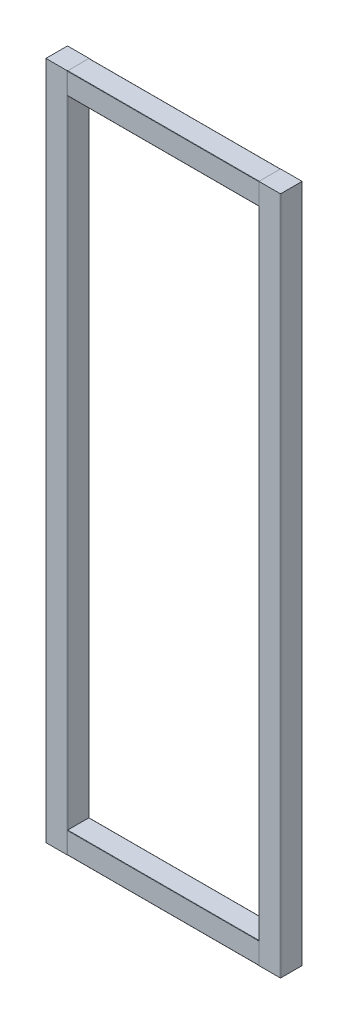
ISO-10303-21;
HEADER;
FILE_DESCRIPTION(('STEP AP214'),'2;1');
FILE_NAME('part.step','',(''),(''),'','','');
FILE_SCHEMA(('AUTOMOTIVE_DESIGN { 1 0 10303 214 1 1 1 1 }'));
ENDSEC;
DATA;
#1=APPLICATION_CONTEXT('core data for automotive mechanical design processes');
#2=APPLICATION_PROTOCOL_DEFINITION('international standard','automotive_design',2000,#1);
#3=PRODUCT_CONTEXT('',#1,'mechanical');
#4=PRODUCT('Part','Part','',(#3));
#5=PRODUCT_RELATED_PRODUCT_CATEGORY('part','',(#4));
#6=PRODUCT_DEFINITION_FORMATION('','',#4);
#7=PRODUCT_DEFINITION_CONTEXT('part definition',#1,'design');
#8=PRODUCT_DEFINITION('design','',#6,#7);
#9=PRODUCT_DEFINITION_SHAPE('','',#8);
#10=(LENGTH_UNIT() NAMED_UNIT(*) SI_UNIT(.MILLI.,.METRE.));
#11=(NAMED_UNIT(*) PLANE_ANGLE_UNIT() SI_UNIT($,.RADIAN.));
#12=(NAMED_UNIT(*) SI_UNIT($,.STERADIAN.) SOLID_ANGLE_UNIT());
#13=UNCERTAINTY_MEASURE_WITH_UNIT(LENGTH_MEASURE(1.E-05),#10,'distance_accuracy_value','');
#14=(GEOMETRIC_REPRESENTATION_CONTEXT(3) GLOBAL_UNCERTAINTY_ASSIGNED_CONTEXT((#13)) GLOBAL_UNIT_ASSIGNED_CONTEXT((#10,
#11,#12)) REPRESENTATION_CONTEXT('',''));
#15=CARTESIAN_POINT('',(0.,0.,0.));
#16=DIRECTION('',(0.,0.,1.));
#17=DIRECTION('',(1.,0.,0.));
#18=AXIS2_PLACEMENT_3D('',#15,#16,#17);
#19=CARTESIAN_POINT('',(155.5,532.5,-17.));
#20=DIRECTION('',(0.,-1.,0.));
#21=DIRECTION('',(0.,0.,-1.));
#22=AXIS2_PLACEMENT_3D('',#19,#20,#21);
#23=CYLINDRICAL_SURFACE('',#22,0.5);
#24=CARTESIAN_POINT('',(155.5,-550.,-17.));
#25=DIRECTION('',(0.,-1.,0.));
#26=DIRECTION('',(0.,0.,-1.));
#27=AXIS2_PLACEMENT_3D('',#24,#25,#26);
#28=CIRCLE('',#27,0.5);
#29=CARTESIAN_POINT('',(155.,-550.,-17.));
#30=VERTEX_POINT('',#29);
#31=CARTESIAN_POINT('',(155.5,-550.,-17.5));
#32=VERTEX_POINT('',#31);
#33=EDGE_CURVE('E161',#30,#32,#28,.T.);
#34=ORIENTED_EDGE('',*,*,#33,.F.);
#35=DIRECTION('',(0.,-1.,0.));
#36=VECTOR('',#35,1.);
#37=CARTESIAN_POINT('',(155.,532.5,-17.));
#38=LINE('',#37,#36);
#39=CARTESIAN_POINT('',(155.,550.,-17.));
#40=VERTEX_POINT('',#39);
#41=EDGE_CURVE('E203',#40,#30,#38,.T.);
#42=ORIENTED_EDGE('',*,*,#41,.F.);
#43=CARTESIAN_POINT('',(155.5,550.,-17.));
#44=DIRECTION('',(0.,1.,0.));
#45=DIRECTION('',(0.,0.,1.));
#46=AXIS2_PLACEMENT_3D('',#43,#44,#45);
#47=CIRCLE('',#46,0.5);
#48=CARTESIAN_POINT('',(155.5,550.,-17.5));
#49=VERTEX_POINT('',#48);
#50=EDGE_CURVE('E148',#49,#40,#47,.T.);
#51=ORIENTED_EDGE('',*,*,#50,.F.);
#52=DIRECTION('',(0.,-1.,0.));
#53=VECTOR('',#52,1.);
#54=CARTESIAN_POINT('',(155.5,532.5,-17.5));
#55=LINE('',#54,#53);
#56=EDGE_CURVE('E84',#49,#32,#55,.T.);
#57=ORIENTED_EDGE('',*,*,#56,.T.);
#58=EDGE_LOOP('',(#34,#42,#51,#57));
#59=FACE_BOUND('',#58,.T.);
#60=ADVANCED_FACE('F80',(#59),#23,.T.);
#61=CARTESIAN_POINT('',(155.,532.5,-17.));
#62=DIRECTION('',(1.,0.,0.));
#63=DIRECTION('',(0.,0.,-1.));
#64=AXIS2_PLACEMENT_3D('',#61,#62,#63);
#65=PLANE('',#64);
#66=DIRECTION('',(0.,0.,-1.));
#67=VECTOR('',#66,1.);
#68=CARTESIAN_POINT('',(155.,-550.,-17.));
#69=LINE('',#68,#67);
#70=CARTESIAN_POINT('',(155.,-550.,17.));
#71=VERTEX_POINT('',#70);
#72=EDGE_CURVE('E155',#71,#30,#69,.T.);
#73=ORIENTED_EDGE('',*,*,#72,.F.);
#74=DIRECTION('',(0.,-1.,0.));
#75=VECTOR('',#74,1.);
#76=CARTESIAN_POINT('',(155.,532.5,17.));
#77=LINE('',#76,#75);
#78=CARTESIAN_POINT('',(155.,550.,17.));
#79=VERTEX_POINT('',#78);
#80=EDGE_CURVE('E200',#79,#71,#77,.T.);
#81=ORIENTED_EDGE('',*,*,#80,.F.);
#82=DIRECTION('',(0.,0.,1.));
#83=VECTOR('',#82,1.);
#84=CARTESIAN_POINT('',(155.,550.,-17.));
#85=LINE('',#84,#83);
#86=EDGE_CURVE('E232',#40,#79,#85,.T.);
#87=ORIENTED_EDGE('',*,*,#86,.F.);
#88=ORIENTED_EDGE('',*,*,#41,.T.);
#89=EDGE_LOOP('',(#73,#81,#87,#88));
#90=FACE_BOUND('',#89,.T.);
#91=ADVANCED_FACE('F221',(#90),#65,.F.);
#92=CARTESIAN_POINT('',(155.5,532.5,17.));
#93=DIRECTION('',(0.,-1.,0.));
#94=DIRECTION('',(0.,0.,-1.));
#95=AXIS2_PLACEMENT_3D('',#92,#93,#94);
#96=CYLINDRICAL_SURFACE('',#95,0.5);
#97=CARTESIAN_POINT('',(155.5,-550.,17.));
#98=DIRECTION('',(0.,-1.,0.));
#99=DIRECTION('',(0.,0.,-1.));
#100=AXIS2_PLACEMENT_3D('',#97,#98,#99);
#101=CIRCLE('',#100,0.5);
#102=CARTESIAN_POINT('',(155.5,-550.,17.5));
#103=VERTEX_POINT('',#102);
#104=EDGE_CURVE('E13',#103,#71,#101,.T.);
#105=ORIENTED_EDGE('',*,*,#104,.F.);
#106=DIRECTION('',(0.,-1.,0.));
#107=VECTOR('',#106,1.);
#108=CARTESIAN_POINT('',(155.5,532.5,17.5));
#109=LINE('',#108,#107);
#110=CARTESIAN_POINT('',(155.5,550.,17.5));
#111=VERTEX_POINT('',#110);
#112=EDGE_CURVE('E196',#111,#103,#109,.T.);
#113=ORIENTED_EDGE('',*,*,#112,.F.);
#114=CARTESIAN_POINT('',(155.5,550.,17.));
#115=DIRECTION('',(0.,1.,0.));
#116=DIRECTION('',(0.,0.,1.));
#117=AXIS2_PLACEMENT_3D('',#114,#115,#116);
#118=CIRCLE('',#117,0.5);
#119=EDGE_CURVE('E228',#79,#111,#118,.T.);
#120=ORIENTED_EDGE('',*,*,#119,.F.);
#121=ORIENTED_EDGE('',*,*,#80,.T.);
#122=EDGE_LOOP('',(#105,#113,#120,#121));
#123=FACE_BOUND('',#122,.T.);
#124=ADVANCED_FACE('F225',(#123),#96,.T.);
#125=CARTESIAN_POINT('',(189.5,532.5,17.5));
#126=DIRECTION('',(0.,0.,-1.));
#127=DIRECTION('',(-1.,0.,0.));
#128=AXIS2_PLACEMENT_3D('',#125,#126,#127);
#129=PLANE('',#128);
#130=DIRECTION('',(-1.,0.,0.));
#131=VECTOR('',#130,1.);
#132=CARTESIAN_POINT('',(189.5,-550.,17.5));
#133=LINE('',#132,#131);
#134=CARTESIAN_POINT('',(189.5,-550.,17.5));
#135=VERTEX_POINT('',#134);
#136=EDGE_CURVE('E90',#135,#103,#133,.T.);
#137=ORIENTED_EDGE('',*,*,#136,.F.);
#138=DIRECTION('',(0.,-1.,0.));
#139=VECTOR('',#138,1.);
#140=CARTESIAN_POINT('',(189.5,532.5,17.5));
#141=LINE('',#140,#139);
#142=CARTESIAN_POINT('',(189.5,550.,17.5));
#143=VERTEX_POINT('',#142);
#144=EDGE_CURVE('E192',#143,#135,#141,.T.);
#145=ORIENTED_EDGE('',*,*,#144,.F.);
#146=DIRECTION('',(1.,0.,0.));
#147=VECTOR('',#146,1.);
#148=CARTESIAN_POINT('',(189.5,550.,17.5));
#149=LINE('',#148,#147);
#150=EDGE_CURVE('E231',#111,#143,#149,.T.);
#151=ORIENTED_EDGE('',*,*,#150,.F.);
#152=ORIENTED_EDGE('',*,*,#112,.T.);
#153=EDGE_LOOP('',(#137,#145,#151,#152));
#154=FACE_BOUND('',#153,.T.);
#155=ADVANCED_FACE('F249',(#154),#129,.F.);
#156=CARTESIAN_POINT('',(189.5,532.5,17.));
#157=DIRECTION('',(0.,-1.,0.));
#158=DIRECTION('',(0.,0.,-1.));
#159=AXIS2_PLACEMENT_3D('',#156,#157,#158);
#160=CYLINDRICAL_SURFACE('',#159,0.500000000000002);
#161=CARTESIAN_POINT('',(189.5,-550.,17.));
#162=DIRECTION('',(0.,-1.,0.));
#163=DIRECTION('',(0.,0.,-1.));
#164=AXIS2_PLACEMENT_3D('',#161,#162,#163);
#165=CIRCLE('',#164,0.500000000000002);
#166=CARTESIAN_POINT('',(190.,-550.,17.));
#167=VERTEX_POINT('',#166);
#168=EDGE_CURVE('E174',#167,#135,#165,.T.);
#169=ORIENTED_EDGE('',*,*,#168,.F.);
#170=DIRECTION('',(0.,-1.,0.));
#171=VECTOR('',#170,1.);
#172=CARTESIAN_POINT('',(190.,532.5,17.));
#173=LINE('',#172,#171);
#174=CARTESIAN_POINT('',(190.,550.,17.));
#175=VERTEX_POINT('',#174);
#176=EDGE_CURVE('E188',#175,#167,#173,.T.);
#177=ORIENTED_EDGE('',*,*,#176,.F.);
#178=CARTESIAN_POINT('',(189.5,550.,17.));
#179=DIRECTION('',(0.,1.,0.));
#180=DIRECTION('',(0.,0.,1.));
#181=AXIS2_PLACEMENT_3D('',#178,#179,#180);
#182=CIRCLE('',#181,0.500000000000002);
#183=EDGE_CURVE('E163',#143,#175,#182,.T.);
#184=ORIENTED_EDGE('',*,*,#183,.F.);
#185=ORIENTED_EDGE('',*,*,#144,.T.);
#186=EDGE_LOOP('',(#169,#177,#184,#185));
#187=FACE_BOUND('',#186,.T.);
#188=ADVANCED_FACE('F246',(#187),#160,.T.);
#189=CARTESIAN_POINT('',(190.,532.5,-17.));
#190=DIRECTION('',(-1.,0.,0.));
#191=DIRECTION('',(0.,0.,1.));
#192=AXIS2_PLACEMENT_3D('',#189,#190,#191);
#193=PLANE('',#192);
#194=DIRECTION('',(0.,0.,1.));
#195=VECTOR('',#194,1.);
#196=CARTESIAN_POINT('',(190.,-550.,-17.));
#197=LINE('',#196,#195);
#198=CARTESIAN_POINT('',(190.,-550.,-17.));
#199=VERTEX_POINT('',#198);
#200=EDGE_CURVE('E178',#199,#167,#197,.T.);
#201=ORIENTED_EDGE('',*,*,#200,.F.);
#202=DIRECTION('',(0.,-1.,0.));
#203=VECTOR('',#202,1.);
#204=CARTESIAN_POINT('',(190.,532.5,-17.));
#205=LINE('',#204,#203);
#206=CARTESIAN_POINT('',(190.,550.,-17.));
#207=VERTEX_POINT('',#206);
#208=EDGE_CURVE('E141',#207,#199,#205,.T.);
#209=ORIENTED_EDGE('',*,*,#208,.F.);
#210=DIRECTION('',(0.,0.,-1.));
#211=VECTOR('',#210,1.);
#212=CARTESIAN_POINT('',(190.,550.,-17.));
#213=LINE('',#212,#211);
#214=EDGE_CURVE('E153',#175,#207,#213,.T.);
#215=ORIENTED_EDGE('',*,*,#214,.F.);
#216=ORIENTED_EDGE('',*,*,#176,.T.);
#217=EDGE_LOOP('',(#201,#209,#215,#216));
#218=FACE_BOUND('',#217,.T.);
#219=ADVANCED_FACE('F254',(#218),#193,.F.);
#220=CARTESIAN_POINT('',(189.5,532.5,-17.));
#221=DIRECTION('',(0.,-1.,0.));
#222=DIRECTION('',(0.,0.,-1.));
#223=AXIS2_PLACEMENT_3D('',#220,#221,#222);
#224=CYLINDRICAL_SURFACE('',#223,0.5);
#225=CARTESIAN_POINT('',(189.5,-550.,-17.));
#226=DIRECTION('',(0.,-1.,0.));
#227=DIRECTION('',(0.,0.,-1.));
#228=AXIS2_PLACEMENT_3D('',#225,#226,#227);
#229=CIRCLE('',#228,0.5);
#230=CARTESIAN_POINT('',(189.5,-550.,-17.5));
#231=VERTEX_POINT('',#230);
#232=EDGE_CURVE('E137',#231,#199,#229,.T.);
#233=ORIENTED_EDGE('',*,*,#232,.F.);
#234=DIRECTION('',(0.,-1.,0.));
#235=VECTOR('',#234,1.);
#236=CARTESIAN_POINT('',(189.5,532.5,-17.5));
#237=LINE('',#236,#235);
#238=CARTESIAN_POINT('',(189.5,550.,-17.5));
#239=VERTEX_POINT('',#238);
#240=EDGE_CURVE('E98',#239,#231,#237,.T.);
#241=ORIENTED_EDGE('',*,*,#240,.F.);
#242=CARTESIAN_POINT('',(189.5,550.,-17.));
#243=DIRECTION('',(0.,1.,0.));
#244=DIRECTION('',(0.,0.,1.));
#245=AXIS2_PLACEMENT_3D('',#242,#243,#244);
#246=CIRCLE('',#245,0.5);
#247=EDGE_CURVE('E134',#207,#239,#246,.T.);
#248=ORIENTED_EDGE('',*,*,#247,.F.);
#249=ORIENTED_EDGE('',*,*,#208,.T.);
#250=EDGE_LOOP('',(#233,#241,#248,#249));
#251=FACE_BOUND('',#250,.T.);
#252=ADVANCED_FACE('F131',(#251),#224,.T.);
#253=CARTESIAN_POINT('',(189.5,532.5,-17.5));
#254=DIRECTION('',(0.,0.,1.));
#255=DIRECTION('',(1.,0.,0.));
#256=AXIS2_PLACEMENT_3D('',#253,#254,#255);
#257=PLANE('',#256);
#258=DIRECTION('',(1.,0.,0.));
#259=VECTOR('',#258,1.);
#260=CARTESIAN_POINT('',(189.5,-550.,-17.5));
#261=LINE('',#260,#259);
#262=EDGE_CURVE('E169',#32,#231,#261,.T.);
#263=ORIENTED_EDGE('',*,*,#262,.F.);
#264=ORIENTED_EDGE('',*,*,#56,.F.);
#265=DIRECTION('',(-1.,0.,0.));
#266=VECTOR('',#265,1.);
#267=CARTESIAN_POINT('',(189.5,550.,-17.5));
#268=LINE('',#267,#266);
#269=EDGE_CURVE('E140',#239,#49,#268,.T.);
#270=ORIENTED_EDGE('',*,*,#269,.F.);
#271=ORIENTED_EDGE('',*,*,#240,.T.);
#272=EDGE_LOOP('',(#263,#264,#270,#271));
#273=FACE_BOUND('',#272,.T.);
#274=ADVANCED_FACE('F144',(#273),#257,.F.);
#275=CARTESIAN_POINT('',(172.5,550.,17.5));
#276=DIRECTION('',(0.,1.,0.));
#277=DIRECTION('',(0.,0.,1.));
#278=AXIS2_PLACEMENT_3D('',#275,#276,#277);
#279=PLANE('',#278);
#280=ORIENTED_EDGE('',*,*,#269,.T.);
#281=ORIENTED_EDGE('',*,*,#50,.T.);
#282=ORIENTED_EDGE('',*,*,#86,.T.);
#283=ORIENTED_EDGE('',*,*,#119,.T.);
#284=ORIENTED_EDGE('',*,*,#150,.T.);
#285=ORIENTED_EDGE('',*,*,#183,.T.);
#286=ORIENTED_EDGE('',*,*,#214,.T.);
#287=ORIENTED_EDGE('',*,*,#247,.T.);
#288=EDGE_LOOP('',(#280,#281,#282,#283,#284,#285,#286,#287));
#289=FACE_BOUND('',#288,.T.);
#290=ADVANCED_FACE('F151',(#289),#279,.T.);
#291=CARTESIAN_POINT('',(172.5,-550.,-17.5));
#292=DIRECTION('',(0.,-1.,0.));
#293=DIRECTION('',(0.,0.,-1.));
#294=AXIS2_PLACEMENT_3D('',#291,#292,#293);
#295=PLANE('',#294);
#296=ORIENTED_EDGE('',*,*,#72,.T.);
#297=ORIENTED_EDGE('',*,*,#33,.T.);
#298=ORIENTED_EDGE('',*,*,#262,.T.);
#299=ORIENTED_EDGE('',*,*,#232,.T.);
#300=ORIENTED_EDGE('',*,*,#200,.T.);
#301=ORIENTED_EDGE('',*,*,#168,.T.);
#302=ORIENTED_EDGE('',*,*,#136,.T.);
#303=ORIENTED_EDGE('',*,*,#104,.T.);
#304=EDGE_LOOP('',(#296,#297,#298,#299,#300,#301,#302,#303));
#305=FACE_BOUND('',#304,.T.);
#306=ADVANCED_FACE('F82',(#305),#295,.T.);
#307=CLOSED_SHELL('',(#60,#91,#124,#155,#188,#219,#252,#274,#290,#306));
#308=MANIFOLD_SOLID_BREP('B2',#307);
#309=CARTESIAN_POINT('',(-155.,532.5,-17.));
#310=DIRECTION('',(-1.,0.,0.));
#311=DIRECTION('',(0.,-1.,0.));
#312=AXIS2_PLACEMENT_3D('',#309,#310,#311);
#313=PLANE('',#312);
#314=CARTESIAN_POINT('',(-155.,-549.5,-17.));
#315=DIRECTION('',(-1.,0.,0.));
#316=DIRECTION('',(0.,-1.,0.));
#317=AXIS2_PLACEMENT_3D('',#314,#315,#316);
#318=CIRCLE('',#317,0.5);
#319=CARTESIAN_POINT('',(-155.,-549.5,-17.5));
#320=VERTEX_POINT('',#319);
#321=CARTESIAN_POINT('',(-155.,-550.,-17.));
#322=VERTEX_POINT('',#321);
#323=EDGE_CURVE('E512',#320,#322,#318,.T.);
#324=ORIENTED_EDGE('',*,*,#323,.T.);
#325=DIRECTION('',(0.,0.,1.));
#326=VECTOR('',#325,1.);
#327=CARTESIAN_POINT('',(-155.,-550.,-17.));
#328=LINE('',#327,#326);
#329=CARTESIAN_POINT('',(-155.,-550.,17.));
#330=VERTEX_POINT('',#329);
#331=EDGE_CURVE('E517',#322,#330,#328,.T.);
#332=ORIENTED_EDGE('',*,*,#331,.T.);
#333=CARTESIAN_POINT('',(-155.,-549.5,17.));
#334=DIRECTION('',(-1.,0.,0.));
#335=DIRECTION('',(0.,-1.,0.));
#336=AXIS2_PLACEMENT_3D('',#333,#334,#335);
#337=CIRCLE('',#336,0.5);
#338=CARTESIAN_POINT('',(-155.,-549.5,17.5));
#339=VERTEX_POINT('',#338);
#340=EDGE_CURVE('E545',#330,#339,#337,.T.);
#341=ORIENTED_EDGE('',*,*,#340,.T.);
#342=DIRECTION('',(0.,-1.,0.));
#343=VECTOR('',#342,1.);
#344=CARTESIAN_POINT('',(-155.,532.5,17.5));
#345=LINE('',#344,#343);
#346=CARTESIAN_POINT('',(-155.,-515.5,17.5));
#347=VERTEX_POINT('',#346);
#348=EDGE_CURVE('E462',#347,#339,#345,.T.);
#349=ORIENTED_EDGE('',*,*,#348,.F.);
#350=CARTESIAN_POINT('',(-155.,-515.5,17.));
#351=DIRECTION('',(-1.,0.,0.));
#352=DIRECTION('',(0.,-1.,0.));
#353=AXIS2_PLACEMENT_3D('',#350,#351,#352);
#354=CIRCLE('',#353,0.500000000000002);
#355=CARTESIAN_POINT('',(-155.,-515.,17.));
#356=VERTEX_POINT('',#355);
#357=EDGE_CURVE('E465',#347,#356,#354,.T.);
#358=ORIENTED_EDGE('',*,*,#357,.T.);
#359=DIRECTION('',(0.,0.,-1.));
#360=VECTOR('',#359,1.);
#361=CARTESIAN_POINT('',(-155.,-515.,-17.));
#362=LINE('',#361,#360);
#363=CARTESIAN_POINT('',(-155.,-515.,-17.));
#364=VERTEX_POINT('',#363);
#365=EDGE_CURVE('E550',#356,#364,#362,.T.);
#366=ORIENTED_EDGE('',*,*,#365,.T.);
#367=CARTESIAN_POINT('',(-155.,-515.5,-17.));
#368=DIRECTION('',(-1.,0.,0.));
#369=DIRECTION('',(0.,-1.,0.));
#370=AXIS2_PLACEMENT_3D('',#367,#368,#369);
#371=CIRCLE('',#370,0.5);
#372=CARTESIAN_POINT('',(-155.,-515.5,-17.5));
#373=VERTEX_POINT('',#372);
#374=EDGE_CURVE('E541',#364,#373,#371,.T.);
#375=ORIENTED_EDGE('',*,*,#374,.T.);
#376=DIRECTION('',(0.,-1.,0.));
#377=VECTOR('',#376,1.);
#378=CARTESIAN_POINT('',(-155.,-515.5,-17.5));
#379=LINE('',#378,#377);
#380=EDGE_CURVE('E433',#373,#320,#379,.T.);
#381=ORIENTED_EDGE('',*,*,#380,.T.);
#382=EDGE_LOOP('',(#324,#332,#341,#349,#358,#366,#375,#381));
#383=FACE_BOUND('',#382,.T.);
#384=ADVANCED_FACE('F424',(#383),#313,.T.);
#385=CARTESIAN_POINT('',(-172.5,-515.5,-17.5));
#386=DIRECTION('',(0.,0.,1.));
#387=DIRECTION('',(1.,0.,0.));
#388=AXIS2_PLACEMENT_3D('',#385,#386,#387);
#389=PLANE('',#388);
#390=DIRECTION('',(0.,1.,0.));
#391=VECTOR('',#390,1.);
#392=CARTESIAN_POINT('',(155.,-515.5,-17.5));
#393=LINE('',#392,#391);
#394=CARTESIAN_POINT('',(155.,-549.5,-17.5));
#395=VERTEX_POINT('',#394);
#396=CARTESIAN_POINT('',(155.,-515.5,-17.5));
#397=VERTEX_POINT('',#396);
#398=EDGE_CURVE('E78',#395,#397,#393,.T.);
#399=ORIENTED_EDGE('',*,*,#398,.F.);
#400=DIRECTION('',(1.,0.,0.));
#401=VECTOR('',#400,1.);
#402=CARTESIAN_POINT('',(-172.5,-549.5,-17.5));
#403=LINE('',#402,#401);
#404=EDGE_CURVE('E522',#320,#395,#403,.T.);
#405=ORIENTED_EDGE('',*,*,#404,.F.);
#406=ORIENTED_EDGE('',*,*,#380,.F.);
#407=DIRECTION('',(1.,0.,0.));
#408=VECTOR('',#407,1.);
#409=CARTESIAN_POINT('',(-172.5,-515.5,-17.5));
#410=LINE('',#409,#408);
#411=EDGE_CURVE('E503',#373,#397,#410,.T.);
#412=ORIENTED_EDGE('',*,*,#411,.T.);
#413=EDGE_LOOP('',(#399,#405,#406,#412));
#414=FACE_BOUND('',#413,.T.);
#415=ADVANCED_FACE('F510',(#414),#389,.F.);
#416=CARTESIAN_POINT('',(-172.5,-515.5,-17.));
#417=DIRECTION('',(1.,0.,0.));
#418=DIRECTION('',(0.,0.,-1.));
#419=AXIS2_PLACEMENT_3D('',#416,#417,#418);
#420=CYLINDRICAL_SURFACE('',#419,0.5);
#421=CARTESIAN_POINT('',(155.,-515.5,-17.));
#422=DIRECTION('',(1.,0.,0.));
#423=DIRECTION('',(0.,0.,-1.));
#424=AXIS2_PLACEMENT_3D('',#421,#422,#423);
#425=CIRCLE('',#424,0.5);
#426=CARTESIAN_POINT('',(155.,-515.,-17.));
#427=VERTEX_POINT('',#426);
#428=EDGE_CURVE('E492',#397,#427,#425,.T.);
#429=ORIENTED_EDGE('',*,*,#428,.F.);
#430=ORIENTED_EDGE('',*,*,#411,.F.);
#431=ORIENTED_EDGE('',*,*,#374,.F.);
#432=DIRECTION('',(1.,0.,0.));
#433=VECTOR('',#432,1.);
#434=CARTESIAN_POINT('',(-172.5,-515.,-17.));
#435=LINE('',#434,#433);
#436=EDGE_CURVE('E505',#364,#427,#435,.T.);
#437=ORIENTED_EDGE('',*,*,#436,.T.);
#438=EDGE_LOOP('',(#429,#430,#431,#437));
#439=FACE_BOUND('',#438,.T.);
#440=ADVANCED_FACE('F501',(#439),#420,.T.);
#441=CARTESIAN_POINT('',(-172.5,-515.,-17.));
#442=DIRECTION('',(0.,-1.,0.));
#443=DIRECTION('',(0.,0.,-1.));
#444=AXIS2_PLACEMENT_3D('',#441,#442,#443);
#445=PLANE('',#444);
#446=DIRECTION('',(0.,0.,1.));
#447=VECTOR('',#446,1.);
#448=CARTESIAN_POINT('',(155.,-515.,-17.));
#449=LINE('',#448,#447);
#450=CARTESIAN_POINT('',(155.,-515.,17.));
#451=VERTEX_POINT('',#450);
#452=EDGE_CURVE('E507',#427,#451,#449,.T.);
#453=ORIENTED_EDGE('',*,*,#452,.F.);
#454=ORIENTED_EDGE('',*,*,#436,.F.);
#455=ORIENTED_EDGE('',*,*,#365,.F.);
#456=DIRECTION('',(1.,0.,0.));
#457=VECTOR('',#456,1.);
#458=CARTESIAN_POINT('',(-172.5,-515.,17.));
#459=LINE('',#458,#457);
#460=EDGE_CURVE('E519',#356,#451,#459,.T.);
#461=ORIENTED_EDGE('',*,*,#460,.T.);
#462=EDGE_LOOP('',(#453,#454,#455,#461));
#463=FACE_BOUND('',#462,.T.);
#464=ADVANCED_FACE('F572',(#463),#445,.F.);
#465=CARTESIAN_POINT('',(-172.5,-515.5,17.));
#466=DIRECTION('',(1.,0.,0.));
#467=DIRECTION('',(0.,0.,-1.));
#468=AXIS2_PLACEMENT_3D('',#465,#466,#467);
#469=CYLINDRICAL_SURFACE('',#468,0.500000000000002);
#470=CARTESIAN_POINT('',(155.,-515.5,17.));
#471=DIRECTION('',(1.,0.,0.));
#472=DIRECTION('',(0.,0.,-1.));
#473=AXIS2_PLACEMENT_3D('',#470,#471,#472);
#474=CIRCLE('',#473,0.500000000000002);
#475=CARTESIAN_POINT('',(155.,-515.5,17.5));
#476=VERTEX_POINT('',#475);
#477=EDGE_CURVE('E577',#451,#476,#474,.T.);
#478=ORIENTED_EDGE('',*,*,#477,.F.);
#479=ORIENTED_EDGE('',*,*,#460,.F.);
#480=ORIENTED_EDGE('',*,*,#357,.F.);
#481=DIRECTION('',(1.,0.,0.));
#482=VECTOR('',#481,1.);
#483=CARTESIAN_POINT('',(-172.5,-515.5,17.5));
#484=LINE('',#483,#482);
#485=EDGE_CURVE('E564',#347,#476,#484,.T.);
#486=ORIENTED_EDGE('',*,*,#485,.T.);
#487=EDGE_LOOP('',(#478,#479,#480,#486));
#488=FACE_BOUND('',#487,.T.);
#489=ADVANCED_FACE('F575',(#488),#469,.T.);
#490=CARTESIAN_POINT('',(-172.5,-515.5,17.5));
#491=DIRECTION('',(0.,0.,-1.));
#492=DIRECTION('',(0.,1.,0.));
#493=AXIS2_PLACEMENT_3D('',#490,#491,#492);
#494=PLANE('',#493);
#495=DIRECTION('',(0.,-1.,0.));
#496=VECTOR('',#495,1.);
#497=CARTESIAN_POINT('',(155.,532.5,17.5));
#498=LINE('',#497,#496);
#499=CARTESIAN_POINT('',(155.,-549.5,17.5));
#500=VERTEX_POINT('',#499);
#501=EDGE_CURVE('E508',#476,#500,#498,.T.);
#502=ORIENTED_EDGE('',*,*,#501,.F.);
#503=ORIENTED_EDGE('',*,*,#485,.F.);
#504=ORIENTED_EDGE('',*,*,#348,.T.);
#505=DIRECTION('',(1.,0.,0.));
#506=VECTOR('',#505,1.);
#507=CARTESIAN_POINT('',(-172.5,-549.5,17.5));
#508=LINE('',#507,#506);
#509=EDGE_CURVE('E556',#339,#500,#508,.T.);
#510=ORIENTED_EDGE('',*,*,#509,.T.);
#511=EDGE_LOOP('',(#502,#503,#504,#510));
#512=FACE_BOUND('',#511,.T.);
#513=ADVANCED_FACE('F596',(#512),#494,.F.);
#514=CARTESIAN_POINT('',(-172.5,-549.5,17.));
#515=DIRECTION('',(1.,0.,0.));
#516=DIRECTION('',(0.,0.,-1.));
#517=AXIS2_PLACEMENT_3D('',#514,#515,#516);
#518=CYLINDRICAL_SURFACE('',#517,0.5);
#519=CARTESIAN_POINT('',(155.,-549.5,17.));
#520=DIRECTION('',(1.,0.,0.));
#521=DIRECTION('',(0.,0.,-1.));
#522=AXIS2_PLACEMENT_3D('',#519,#520,#521);
#523=CIRCLE('',#522,0.5);
#524=CARTESIAN_POINT('',(155.,-550.,17.));
#525=VERTEX_POINT('',#524);
#526=EDGE_CURVE('E536',#500,#525,#523,.T.);
#527=ORIENTED_EDGE('',*,*,#526,.F.);
#528=ORIENTED_EDGE('',*,*,#509,.F.);
#529=ORIENTED_EDGE('',*,*,#340,.F.);
#530=DIRECTION('',(1.,0.,0.));
#531=VECTOR('',#530,1.);
#532=CARTESIAN_POINT('',(-172.5,-550.,17.));
#533=LINE('',#532,#531);
#534=EDGE_CURVE('E530',#330,#525,#533,.T.);
#535=ORIENTED_EDGE('',*,*,#534,.T.);
#536=EDGE_LOOP('',(#527,#528,#529,#535));
#537=FACE_BOUND('',#536,.T.);
#538=ADVANCED_FACE('F593',(#537),#518,.T.);
#539=CARTESIAN_POINT('',(-172.5,-550.,-17.));
#540=DIRECTION('',(0.,1.,0.));
#541=DIRECTION('',(0.,0.,1.));
#542=AXIS2_PLACEMENT_3D('',#539,#540,#541);
#543=PLANE('',#542);
#544=DIRECTION('',(0.,0.,-1.));
#545=VECTOR('',#544,1.);
#546=CARTESIAN_POINT('',(155.,-550.,-17.));
#547=LINE('',#546,#545);
#548=CARTESIAN_POINT('',(155.,-550.,-17.));
#549=VERTEX_POINT('',#548);
#550=EDGE_CURVE('E532',#525,#549,#547,.T.);
#551=ORIENTED_EDGE('',*,*,#550,.F.);
#552=ORIENTED_EDGE('',*,*,#534,.F.);
#553=ORIENTED_EDGE('',*,*,#331,.F.);
#554=DIRECTION('',(1.,0.,0.));
#555=VECTOR('',#554,1.);
#556=CARTESIAN_POINT('',(-172.5,-550.,-17.));
#557=LINE('',#556,#555);
#558=EDGE_CURVE('E524',#322,#549,#557,.T.);
#559=ORIENTED_EDGE('',*,*,#558,.T.);
#560=EDGE_LOOP('',(#551,#552,#553,#559));
#561=FACE_BOUND('',#560,.T.);
#562=ADVANCED_FACE('F603',(#561),#543,.F.);
#563=CARTESIAN_POINT('',(-172.5,-549.5,-17.));
#564=DIRECTION('',(1.,0.,0.));
#565=DIRECTION('',(0.,0.,-1.));
#566=AXIS2_PLACEMENT_3D('',#563,#564,#565);
#567=CYLINDRICAL_SURFACE('',#566,0.5);
#568=CARTESIAN_POINT('',(155.,-549.5,-17.));
#569=DIRECTION('',(1.,0.,0.));
#570=DIRECTION('',(0.,0.,-1.));
#571=AXIS2_PLACEMENT_3D('',#568,#569,#570);
#572=CIRCLE('',#571,0.5);
#573=EDGE_CURVE('E439',#549,#395,#572,.T.);
#574=ORIENTED_EDGE('',*,*,#573,.F.);
#575=ORIENTED_EDGE('',*,*,#558,.F.);
#576=ORIENTED_EDGE('',*,*,#323,.F.);
#577=ORIENTED_EDGE('',*,*,#404,.T.);
#578=EDGE_LOOP('',(#574,#575,#576,#577));
#579=FACE_BOUND('',#578,.T.);
#580=ADVANCED_FACE('F426',(#579),#567,.T.);
#581=CARTESIAN_POINT('',(155.,532.5,-17.));
#582=DIRECTION('',(1.,0.,0.));
#583=DIRECTION('',(0.,0.,-1.));
#584=AXIS2_PLACEMENT_3D('',#581,#582,#583);
#585=PLANE('',#584);
#586=ORIENTED_EDGE('',*,*,#573,.T.);
#587=ORIENTED_EDGE('',*,*,#398,.T.);
#588=ORIENTED_EDGE('',*,*,#428,.T.);
#589=ORIENTED_EDGE('',*,*,#452,.T.);
#590=ORIENTED_EDGE('',*,*,#477,.T.);
#591=ORIENTED_EDGE('',*,*,#501,.T.);
#592=ORIENTED_EDGE('',*,*,#526,.T.);
#593=ORIENTED_EDGE('',*,*,#550,.T.);
#594=EDGE_LOOP('',(#586,#587,#588,#589,#590,#591,#592,#593));
#595=FACE_BOUND('',#594,.T.);
#596=ADVANCED_FACE('F491',(#595),#585,.T.);
#597=CLOSED_SHELL('',(#384,#415,#440,#464,#489,#513,#538,#562,#580,#596));
#598=MANIFOLD_SOLID_BREP('B7',#597);
#599=CARTESIAN_POINT('',(-155.,532.5,-17.));
#600=DIRECTION('',(-1.,0.,0.));
#601=DIRECTION('',(0.,-1.,0.));
#602=AXIS2_PLACEMENT_3D('',#599,#600,#601);
#603=PLANE('',#602);
#604=CARTESIAN_POINT('',(-155.,515.5,-17.));
#605=DIRECTION('',(-1.,0.,0.));
#606=DIRECTION('',(0.,-1.,0.));
#607=AXIS2_PLACEMENT_3D('',#604,#605,#606);
#608=CIRCLE('',#607,0.5);
#609=CARTESIAN_POINT('',(-155.,515.5,-17.5));
#610=VERTEX_POINT('',#609);
#611=CARTESIAN_POINT('',(-155.,515.,-17.));
#612=VERTEX_POINT('',#611);
#613=EDGE_CURVE('E875',#610,#612,#608,.T.);
#614=ORIENTED_EDGE('',*,*,#613,.T.);
#615=DIRECTION('',(0.,0.,1.));
#616=VECTOR('',#615,1.);
#617=CARTESIAN_POINT('',(-155.,515.,-17.));
#618=LINE('',#617,#616);
#619=CARTESIAN_POINT('',(-155.,515.,17.));
#620=VERTEX_POINT('',#619);
#621=EDGE_CURVE('E900',#612,#620,#618,.T.);
#622=ORIENTED_EDGE('',*,*,#621,.T.);
#623=CARTESIAN_POINT('',(-155.,515.5,17.));
#624=DIRECTION('',(-1.,0.,0.));
#625=DIRECTION('',(0.,-1.,0.));
#626=AXIS2_PLACEMENT_3D('',#623,#624,#625);
#627=CIRCLE('',#626,0.5);
#628=CARTESIAN_POINT('',(-155.,515.5,17.5));
#629=VERTEX_POINT('',#628);
#630=EDGE_CURVE('E903',#620,#629,#627,.T.);
#631=ORIENTED_EDGE('',*,*,#630,.T.);
#632=DIRECTION('',(0.,-1.,0.));
#633=VECTOR('',#632,1.);
#634=CARTESIAN_POINT('',(-155.,532.5,17.5));
#635=LINE('',#634,#633);
#636=CARTESIAN_POINT('',(-155.,549.5,17.5));
#637=VERTEX_POINT('',#636);
#638=EDGE_CURVE('E865',#637,#629,#635,.T.);
#639=ORIENTED_EDGE('',*,*,#638,.F.);
#640=CARTESIAN_POINT('',(-155.,549.5,17.));
#641=DIRECTION('',(-1.,0.,0.));
#642=DIRECTION('',(0.,-1.,0.));
#643=AXIS2_PLACEMENT_3D('',#640,#641,#642);
#644=CIRCLE('',#643,0.500000000000002);
#645=CARTESIAN_POINT('',(-155.,550.,17.));
#646=VERTEX_POINT('',#645);
#647=EDGE_CURVE('E856',#637,#646,#644,.T.);
#648=ORIENTED_EDGE('',*,*,#647,.T.);
#649=DIRECTION('',(0.,0.,-1.));
#650=VECTOR('',#649,1.);
#651=CARTESIAN_POINT('',(-155.,550.,-17.));
#652=LINE('',#651,#650);
#653=CARTESIAN_POINT('',(-155.,550.,-17.));
#654=VERTEX_POINT('',#653);
#655=EDGE_CURVE('E908',#646,#654,#652,.T.);
#656=ORIENTED_EDGE('',*,*,#655,.T.);
#657=CARTESIAN_POINT('',(-155.,549.5,-17.));
#658=DIRECTION('',(-1.,0.,0.));
#659=DIRECTION('',(0.,-1.,0.));
#660=AXIS2_PLACEMENT_3D('',#657,#658,#659);
#661=CIRCLE('',#660,0.5);
#662=CARTESIAN_POINT('',(-155.,549.5,-17.5));
#663=VERTEX_POINT('',#662);
#664=EDGE_CURVE('E897',#654,#663,#661,.T.);
#665=ORIENTED_EDGE('',*,*,#664,.T.);
#666=DIRECTION('',(0.,-1.,0.));
#667=VECTOR('',#666,1.);
#668=CARTESIAN_POINT('',(-155.,549.5,-17.5));
#669=LINE('',#668,#667);
#670=EDGE_CURVE('E776',#663,#610,#669,.T.);
#671=ORIENTED_EDGE('',*,*,#670,.T.);
#672=EDGE_LOOP('',(#614,#622,#631,#639,#648,#656,#665,#671));
#673=FACE_BOUND('',#672,.T.);
#674=ADVANCED_FACE('F767',(#673),#603,.T.);
#675=CARTESIAN_POINT('',(-172.5,549.5,-17.5));
#676=DIRECTION('',(0.,0.,1.));
#677=DIRECTION('',(1.,0.,0.));
#678=AXIS2_PLACEMENT_3D('',#675,#676,#677);
#679=PLANE('',#678);
#680=DIRECTION('',(0.,1.,0.));
#681=VECTOR('',#680,1.);
#682=CARTESIAN_POINT('',(155.,549.5,-17.5));
#683=LINE('',#682,#681);
#684=CARTESIAN_POINT('',(155.,515.5,-17.5));
#685=VERTEX_POINT('',#684);
#686=CARTESIAN_POINT('',(155.,549.5,-17.5));
#687=VERTEX_POINT('',#686);
#688=EDGE_CURVE('E422',#685,#687,#683,.T.);
#689=ORIENTED_EDGE('',*,*,#688,.F.);
#690=DIRECTION('',(1.,0.,0.));
#691=VECTOR('',#690,1.);
#692=CARTESIAN_POINT('',(-172.5,515.5,-17.5));
#693=LINE('',#692,#691);
#694=EDGE_CURVE('E876',#610,#685,#693,.T.);
#695=ORIENTED_EDGE('',*,*,#694,.F.);
#696=ORIENTED_EDGE('',*,*,#670,.F.);
#697=DIRECTION('',(1.,0.,0.));
#698=VECTOR('',#697,1.);
#699=CARTESIAN_POINT('',(-172.5,549.5,-17.5));
#700=LINE('',#699,#698);
#701=EDGE_CURVE('E872',#663,#687,#700,.T.);
#702=ORIENTED_EDGE('',*,*,#701,.T.);
#703=EDGE_LOOP('',(#689,#695,#696,#702));
#704=FACE_BOUND('',#703,.T.);
#705=ADVANCED_FACE('F927',(#704),#679,.F.);
#706=CARTESIAN_POINT('',(-172.5,549.5,-17.));
#707=DIRECTION('',(1.,0.,0.));
#708=DIRECTION('',(0.,0.,-1.));
#709=AXIS2_PLACEMENT_3D('',#706,#707,#708);
#710=CYLINDRICAL_SURFACE('',#709,0.5);
#711=CARTESIAN_POINT('',(155.,549.5,-17.));
#712=DIRECTION('',(1.,0.,0.));
#713=DIRECTION('',(0.,0.,-1.));
#714=AXIS2_PLACEMENT_3D('',#711,#712,#713);
#715=CIRCLE('',#714,0.5);
#716=CARTESIAN_POINT('',(155.,550.,-17.));
#717=VERTEX_POINT('',#716);
#718=EDGE_CURVE('E852',#687,#717,#715,.T.);
#719=ORIENTED_EDGE('',*,*,#718,.F.);
#720=ORIENTED_EDGE('',*,*,#701,.F.);
#721=ORIENTED_EDGE('',*,*,#664,.F.);
#722=DIRECTION('',(1.,0.,0.));
#723=VECTOR('',#722,1.);
#724=CARTESIAN_POINT('',(-172.5,550.,-17.));
#725=LINE('',#724,#723);
#726=EDGE_CURVE('E863',#654,#717,#725,.T.);
#727=ORIENTED_EDGE('',*,*,#726,.T.);
#728=EDGE_LOOP('',(#719,#720,#721,#727));
#729=FACE_BOUND('',#728,.T.);
#730=ADVANCED_FACE('F931',(#729),#710,.T.);
#731=CARTESIAN_POINT('',(-172.5,550.,-17.));
#732=DIRECTION('',(0.,-1.,0.));
#733=DIRECTION('',(0.,0.,-1.));
#734=AXIS2_PLACEMENT_3D('',#731,#732,#733);
#735=PLANE('',#734);
#736=DIRECTION('',(0.,0.,1.));
#737=VECTOR('',#736,1.);
#738=CARTESIAN_POINT('',(155.,550.,-17.));
#739=LINE('',#738,#737);
#740=CARTESIAN_POINT('',(155.,550.,17.));
#741=VERTEX_POINT('',#740);
#742=EDGE_CURVE('E835',#717,#741,#739,.T.);
#743=ORIENTED_EDGE('',*,*,#742,.F.);
#744=ORIENTED_EDGE('',*,*,#726,.F.);
#745=ORIENTED_EDGE('',*,*,#655,.F.);
#746=DIRECTION('',(1.,0.,0.));
#747=VECTOR('',#746,1.);
#748=CARTESIAN_POINT('',(-172.5,550.,17.));
#749=LINE('',#748,#747);
#750=EDGE_CURVE('E858',#646,#741,#749,.T.);
#751=ORIENTED_EDGE('',*,*,#750,.T.);
#752=EDGE_LOOP('',(#743,#744,#745,#751));
#753=FACE_BOUND('',#752,.T.);
#754=ADVANCED_FACE('F947',(#753),#735,.F.);
#755=CARTESIAN_POINT('',(-172.5,549.5,17.));
#756=DIRECTION('',(1.,0.,0.));
#757=DIRECTION('',(0.,0.,-1.));
#758=AXIS2_PLACEMENT_3D('',#755,#756,#757);
#759=CYLINDRICAL_SURFACE('',#758,0.500000000000002);
#760=CARTESIAN_POINT('',(155.,549.5,17.));
#761=DIRECTION('',(1.,0.,0.));
#762=DIRECTION('',(0.,0.,-1.));
#763=AXIS2_PLACEMENT_3D('',#760,#761,#762);
#764=CIRCLE('',#763,0.500000000000002);
#765=CARTESIAN_POINT('',(155.,549.5,17.5));
#766=VERTEX_POINT('',#765);
#767=EDGE_CURVE('E829',#741,#766,#764,.T.);
#768=ORIENTED_EDGE('',*,*,#767,.F.);
#769=ORIENTED_EDGE('',*,*,#750,.F.);
#770=ORIENTED_EDGE('',*,*,#647,.F.);
#771=DIRECTION('',(1.,0.,0.));
#772=VECTOR('',#771,1.);
#773=CARTESIAN_POINT('',(-172.5,549.5,17.5));
#774=LINE('',#773,#772);
#775=EDGE_CURVE('E848',#637,#766,#774,.T.);
#776=ORIENTED_EDGE('',*,*,#775,.T.);
#777=EDGE_LOOP('',(#768,#769,#770,#776));
#778=FACE_BOUND('',#777,.T.);
#779=ADVANCED_FACE('F855',(#778),#759,.T.);
#780=CARTESIAN_POINT('',(-172.5,549.5,17.5));
#781=DIRECTION('',(0.,0.,-1.));
#782=DIRECTION('',(0.,1.,0.));
#783=AXIS2_PLACEMENT_3D('',#780,#781,#782);
#784=PLANE('',#783);
#785=DIRECTION('',(0.,-1.,0.));
#786=VECTOR('',#785,1.);
#787=CARTESIAN_POINT('',(155.,532.5,17.5));
#788=LINE('',#787,#786);
#789=CARTESIAN_POINT('',(155.,515.5,17.5));
#790=VERTEX_POINT('',#789);
#791=EDGE_CURVE('E832',#766,#790,#788,.T.);
#792=ORIENTED_EDGE('',*,*,#791,.F.);
#793=ORIENTED_EDGE('',*,*,#775,.F.);
#794=ORIENTED_EDGE('',*,*,#638,.T.);
#795=DIRECTION('',(1.,0.,0.));
#796=VECTOR('',#795,1.);
#797=CARTESIAN_POINT('',(-172.5,515.5,17.5));
#798=LINE('',#797,#796);
#799=EDGE_CURVE('E850',#629,#790,#798,.T.);
#800=ORIENTED_EDGE('',*,*,#799,.T.);
#801=EDGE_LOOP('',(#792,#793,#794,#800));
#802=FACE_BOUND('',#801,.T.);
#803=ADVANCED_FACE('F846',(#802),#784,.F.);
#804=CARTESIAN_POINT('',(-172.5,515.5,17.));
#805=DIRECTION('',(1.,0.,0.));
#806=DIRECTION('',(0.,0.,-1.));
#807=AXIS2_PLACEMENT_3D('',#804,#805,#806);
#808=CYLINDRICAL_SURFACE('',#807,0.5);
#809=CARTESIAN_POINT('',(155.,515.5,17.));
#810=DIRECTION('',(1.,0.,0.));
#811=DIRECTION('',(0.,0.,-1.));
#812=AXIS2_PLACEMENT_3D('',#809,#810,#811);
#813=CIRCLE('',#812,0.5);
#814=CARTESIAN_POINT('',(155.,515.,17.));
#815=VERTEX_POINT('',#814);
#816=EDGE_CURVE('E841',#790,#815,#813,.T.);
#817=ORIENTED_EDGE('',*,*,#816,.F.);
#818=ORIENTED_EDGE('',*,*,#799,.F.);
#819=ORIENTED_EDGE('',*,*,#630,.F.);
#820=DIRECTION('',(1.,0.,0.));
#821=VECTOR('',#820,1.);
#822=CARTESIAN_POINT('',(-172.5,515.,17.));
#823=LINE('',#822,#821);
#824=EDGE_CURVE('E886',#620,#815,#823,.T.);
#825=ORIENTED_EDGE('',*,*,#824,.T.);
#826=EDGE_LOOP('',(#817,#818,#819,#825));
#827=FACE_BOUND('',#826,.T.);
#828=ADVANCED_FACE('F920',(#827),#808,.T.);
#829=CARTESIAN_POINT('',(-172.5,515.,-17.));
#830=DIRECTION('',(0.,1.,0.));
#831=DIRECTION('',(0.,0.,1.));
#832=AXIS2_PLACEMENT_3D('',#829,#830,#831);
#833=PLANE('',#832);
#834=DIRECTION('',(0.,0.,-1.));
#835=VECTOR('',#834,1.);
#836=CARTESIAN_POINT('',(155.,515.,-17.));
#837=LINE('',#836,#835);
#838=CARTESIAN_POINT('',(155.,515.,-17.));
#839=VERTEX_POINT('',#838);
#840=EDGE_CURVE('E888',#815,#839,#837,.T.);
#841=ORIENTED_EDGE('',*,*,#840,.F.);
#842=ORIENTED_EDGE('',*,*,#824,.F.);
#843=ORIENTED_EDGE('',*,*,#621,.F.);
#844=DIRECTION('',(1.,0.,0.));
#845=VECTOR('',#844,1.);
#846=CARTESIAN_POINT('',(-172.5,515.,-17.));
#847=LINE('',#846,#845);
#848=EDGE_CURVE('E879',#612,#839,#847,.T.);
#849=ORIENTED_EDGE('',*,*,#848,.T.);
#850=EDGE_LOOP('',(#841,#842,#843,#849));
#851=FACE_BOUND('',#850,.T.);
#852=ADVANCED_FACE('F924',(#851),#833,.F.);
#853=CARTESIAN_POINT('',(-172.5,515.5,-17.));
#854=DIRECTION('',(1.,0.,0.));
#855=DIRECTION('',(0.,0.,-1.));
#856=AXIS2_PLACEMENT_3D('',#853,#854,#855);
#857=CYLINDRICAL_SURFACE('',#856,0.5);
#858=CARTESIAN_POINT('',(155.,515.5,-17.));
#859=DIRECTION('',(1.,0.,0.));
#860=DIRECTION('',(0.,0.,-1.));
#861=AXIS2_PLACEMENT_3D('',#858,#859,#860);
#862=CIRCLE('',#861,0.5);
#863=EDGE_CURVE('E782',#839,#685,#862,.T.);
#864=ORIENTED_EDGE('',*,*,#863,.F.);
#865=ORIENTED_EDGE('',*,*,#848,.F.);
#866=ORIENTED_EDGE('',*,*,#613,.F.);
#867=ORIENTED_EDGE('',*,*,#694,.T.);
#868=EDGE_LOOP('',(#864,#865,#866,#867));
#869=FACE_BOUND('',#868,.T.);
#870=ADVANCED_FACE('F769',(#869),#857,.T.);
#871=CARTESIAN_POINT('',(155.,532.5,-17.));
#872=DIRECTION('',(1.,0.,0.));
#873=DIRECTION('',(0.,0.,-1.));
#874=AXIS2_PLACEMENT_3D('',#871,#872,#873);
#875=PLANE('',#874);
#876=ORIENTED_EDGE('',*,*,#863,.T.);
#877=ORIENTED_EDGE('',*,*,#688,.T.);
#878=ORIENTED_EDGE('',*,*,#718,.T.);
#879=ORIENTED_EDGE('',*,*,#742,.T.);
#880=ORIENTED_EDGE('',*,*,#767,.T.);
#881=ORIENTED_EDGE('',*,*,#791,.T.);
#882=ORIENTED_EDGE('',*,*,#816,.T.);
#883=ORIENTED_EDGE('',*,*,#840,.T.);
#884=EDGE_LOOP('',(#876,#877,#878,#879,#880,#881,#882,#883));
#885=FACE_BOUND('',#884,.T.);
#886=ADVANCED_FACE('F831',(#885),#875,.T.);
#887=CLOSED_SHELL('',(#674,#705,#730,#754,#779,#803,#828,#852,#870,#886));
#888=MANIFOLD_SOLID_BREP('B72',#887);
#889=CARTESIAN_POINT('',(-189.5,532.5,-17.));
#890=DIRECTION('',(0.,-1.,0.));
#891=DIRECTION('',(1.,0.,0.));
#892=AXIS2_PLACEMENT_3D('',#889,#890,#891);
#893=CYLINDRICAL_SURFACE('',#892,0.5);
#894=CARTESIAN_POINT('',(-189.5,-550.,-17.));
#895=DIRECTION('',(0.,-1.,0.));
#896=DIRECTION('',(0.,0.,-1.));
#897=AXIS2_PLACEMENT_3D('',#894,#895,#896);
#898=CIRCLE('',#897,0.5);
#899=CARTESIAN_POINT('',(-190.,-550.,-17.));
#900=VERTEX_POINT('',#899);
#901=CARTESIAN_POINT('',(-189.5,-550.,-17.5));
#902=VERTEX_POINT('',#901);
#903=EDGE_CURVE('E1182',#900,#902,#898,.T.);
#904=ORIENTED_EDGE('',*,*,#903,.F.);
#905=DIRECTION('',(0.,-1.,0.));
#906=VECTOR('',#905,1.);
#907=CARTESIAN_POINT('',(-190.,532.5,-17.));
#908=LINE('',#907,#906);
#909=CARTESIAN_POINT('',(-190.,550.,-17.));
#910=VERTEX_POINT('',#909);
#911=EDGE_CURVE('E1224',#910,#900,#908,.T.);
#912=ORIENTED_EDGE('',*,*,#911,.F.);
#913=CARTESIAN_POINT('',(-189.5,550.,-17.));
#914=DIRECTION('',(0.,1.,0.));
#915=DIRECTION('',(0.,0.,1.));
#916=AXIS2_PLACEMENT_3D('',#913,#914,#915);
#917=CIRCLE('',#916,0.5);
#918=CARTESIAN_POINT('',(-189.5,550.,-17.5));
#919=VERTEX_POINT('',#918);
#920=EDGE_CURVE('E1169',#919,#910,#917,.T.);
#921=ORIENTED_EDGE('',*,*,#920,.F.);
#922=DIRECTION('',(0.,-1.,0.));
#923=VECTOR('',#922,1.);
#924=CARTESIAN_POINT('',(-189.5,532.5,-17.5));
#925=LINE('',#924,#923);
#926=EDGE_CURVE('E1105',#919,#902,#925,.T.);
#927=ORIENTED_EDGE('',*,*,#926,.T.);
#928=EDGE_LOOP('',(#904,#912,#921,#927));
#929=FACE_BOUND('',#928,.T.);
#930=ADVANCED_FACE('F1101',(#929),#893,.T.);
#931=CARTESIAN_POINT('',(-190.,532.5,-17.));
#932=DIRECTION('',(1.,0.,0.));
#933=DIRECTION('',(0.,1.,0.));
#934=AXIS2_PLACEMENT_3D('',#931,#932,#933);
#935=PLANE('',#934);
#936=DIRECTION('',(0.,0.,-1.));
#937=VECTOR('',#936,1.);
#938=CARTESIAN_POINT('',(-190.,-550.,-17.));
#939=LINE('',#938,#937);
#940=CARTESIAN_POINT('',(-190.,-550.,17.));
#941=VERTEX_POINT('',#940);
#942=EDGE_CURVE('E1176',#941,#900,#939,.T.);
#943=ORIENTED_EDGE('',*,*,#942,.F.);
#944=DIRECTION('',(0.,-1.,0.));
#945=VECTOR('',#944,1.);
#946=CARTESIAN_POINT('',(-190.,532.5,17.));
#947=LINE('',#946,#945);
#948=CARTESIAN_POINT('',(-190.,550.,17.));
#949=VERTEX_POINT('',#948);
#950=EDGE_CURVE('E1221',#949,#941,#947,.T.);
#951=ORIENTED_EDGE('',*,*,#950,.F.);
#952=DIRECTION('',(0.,0.,1.));
#953=VECTOR('',#952,1.);
#954=CARTESIAN_POINT('',(-190.,550.,-17.));
#955=LINE('',#954,#953);
#956=EDGE_CURVE('E1253',#910,#949,#955,.T.);
#957=ORIENTED_EDGE('',*,*,#956,.F.);
#958=ORIENTED_EDGE('',*,*,#911,.T.);
#959=EDGE_LOOP('',(#943,#951,#957,#958));
#960=FACE_BOUND('',#959,.T.);
#961=ADVANCED_FACE('F1242',(#960),#935,.F.);
#962=CARTESIAN_POINT('',(-189.5,532.5,17.));
#963=DIRECTION('',(0.,-1.,0.));
#964=DIRECTION('',(1.,0.,0.));
#965=AXIS2_PLACEMENT_3D('',#962,#963,#964);
#966=CYLINDRICAL_SURFACE('',#965,0.5);
#967=CARTESIAN_POINT('',(-189.5,-550.,17.));
#968=DIRECTION('',(0.,-1.,0.));
#969=DIRECTION('',(0.,0.,-1.));
#970=AXIS2_PLACEMENT_3D('',#967,#968,#969);
#971=CIRCLE('',#970,0.5);
#972=CARTESIAN_POINT('',(-189.5,-550.,17.5));
#973=VERTEX_POINT('',#972);
#974=EDGE_CURVE('E765',#973,#941,#971,.T.);
#975=ORIENTED_EDGE('',*,*,#974,.F.);
#976=DIRECTION('',(0.,-1.,0.));
#977=VECTOR('',#976,1.);
#978=CARTESIAN_POINT('',(-189.5,532.5,17.5));
#979=LINE('',#978,#977);
#980=CARTESIAN_POINT('',(-189.5,550.,17.5));
#981=VERTEX_POINT('',#980);
#982=EDGE_CURVE('E1217',#981,#973,#979,.T.);
#983=ORIENTED_EDGE('',*,*,#982,.F.);
#984=CARTESIAN_POINT('',(-189.5,550.,17.));
#985=DIRECTION('',(0.,1.,0.));
#986=DIRECTION('',(0.,0.,1.));
#987=AXIS2_PLACEMENT_3D('',#984,#985,#986);
#988=CIRCLE('',#987,0.5);
#989=EDGE_CURVE('E1249',#949,#981,#988,.T.);
#990=ORIENTED_EDGE('',*,*,#989,.F.);
#991=ORIENTED_EDGE('',*,*,#950,.T.);
#992=EDGE_LOOP('',(#975,#983,#990,#991));
#993=FACE_BOUND('',#992,.T.);
#994=ADVANCED_FACE('F1246',(#993),#966,.T.);
#995=CARTESIAN_POINT('',(-155.5,532.5,17.5));
#996=DIRECTION('',(0.,0.,-1.));
#997=DIRECTION('',(-1.,0.,0.));
#998=AXIS2_PLACEMENT_3D('',#995,#996,#997);
#999=PLANE('',#998);
#1000=DIRECTION('',(-1.,0.,0.));
#1001=VECTOR('',#1000,1.);
#1002=CARTESIAN_POINT('',(-155.5,-550.,17.5));
#1003=LINE('',#1002,#1001);
#1004=CARTESIAN_POINT('',(-155.5,-550.,17.5));
#1005=VERTEX_POINT('',#1004);
#1006=EDGE_CURVE('E1111',#1005,#973,#1003,.T.);
#1007=ORIENTED_EDGE('',*,*,#1006,.F.);
#1008=DIRECTION('',(0.,-1.,0.));
#1009=VECTOR('',#1008,1.);
#1010=CARTESIAN_POINT('',(-155.5,532.5,17.5));
#1011=LINE('',#1010,#1009);
#1012=CARTESIAN_POINT('',(-155.5,550.,17.5));
#1013=VERTEX_POINT('',#1012);
#1014=EDGE_CURVE('E1213',#1013,#1005,#1011,.T.);
#1015=ORIENTED_EDGE('',*,*,#1014,.F.);
#1016=DIRECTION('',(1.,0.,0.));
#1017=VECTOR('',#1016,1.);
#1018=CARTESIAN_POINT('',(-155.5,550.,17.5));
#1019=LINE('',#1018,#1017);
#1020=EDGE_CURVE('E1252',#981,#1013,#1019,.T.);
#1021=ORIENTED_EDGE('',*,*,#1020,.F.);
#1022=ORIENTED_EDGE('',*,*,#982,.T.);
#1023=EDGE_LOOP('',(#1007,#1015,#1021,#1022));
#1024=FACE_BOUND('',#1023,.T.);
#1025=ADVANCED_FACE('F1270',(#1024),#999,.F.);
#1026=CARTESIAN_POINT('',(-155.5,532.5,17.));
#1027=DIRECTION('',(0.,-1.,0.));
#1028=DIRECTION('',(1.,0.,0.));
#1029=AXIS2_PLACEMENT_3D('',#1026,#1027,#1028);
#1030=CYLINDRICAL_SURFACE('',#1029,0.500000000000002);
#1031=CARTESIAN_POINT('',(-155.5,-550.,17.));
#1032=DIRECTION('',(0.,-1.,0.));
#1033=DIRECTION('',(0.,0.,-1.));
#1034=AXIS2_PLACEMENT_3D('',#1031,#1032,#1033);
#1035=CIRCLE('',#1034,0.500000000000002);
#1036=CARTESIAN_POINT('',(-155.,-550.,17.));
#1037=VERTEX_POINT('',#1036);
#1038=EDGE_CURVE('E1195',#1037,#1005,#1035,.T.);
#1039=ORIENTED_EDGE('',*,*,#1038,.F.);
#1040=DIRECTION('',(0.,-1.,0.));
#1041=VECTOR('',#1040,1.);
#1042=CARTESIAN_POINT('',(-155.,532.5,17.));
#1043=LINE('',#1042,#1041);
#1044=CARTESIAN_POINT('',(-155.,550.,17.));
#1045=VERTEX_POINT('',#1044);
#1046=EDGE_CURVE('E1209',#1045,#1037,#1043,.T.);
#1047=ORIENTED_EDGE('',*,*,#1046,.F.);
#1048=CARTESIAN_POINT('',(-155.5,550.,17.));
#1049=DIRECTION('',(0.,1.,0.));
#1050=DIRECTION('',(0.,0.,1.));
#1051=AXIS2_PLACEMENT_3D('',#1048,#1049,#1050);
#1052=CIRCLE('',#1051,0.500000000000002);
#1053=EDGE_CURVE('E1184',#1013,#1045,#1052,.T.);
#1054=ORIENTED_EDGE('',*,*,#1053,.F.);
#1055=ORIENTED_EDGE('',*,*,#1014,.T.);
#1056=EDGE_LOOP('',(#1039,#1047,#1054,#1055));
#1057=FACE_BOUND('',#1056,.T.);
#1058=ADVANCED_FACE('F1267',(#1057),#1030,.T.);
#1059=CARTESIAN_POINT('',(-155.,532.5,-17.));
#1060=DIRECTION('',(-1.,0.,0.));
#1061=DIRECTION('',(0.,-1.,0.));
#1062=AXIS2_PLACEMENT_3D('',#1059,#1060,#1061);
#1063=PLANE('',#1062);
#1064=DIRECTION('',(0.,0.,1.));
#1065=VECTOR('',#1064,1.);
#1066=CARTESIAN_POINT('',(-155.,-550.,-17.));
#1067=LINE('',#1066,#1065);
#1068=CARTESIAN_POINT('',(-155.,-550.,-17.));
#1069=VERTEX_POINT('',#1068);
#1070=EDGE_CURVE('E1199',#1069,#1037,#1067,.T.);
#1071=ORIENTED_EDGE('',*,*,#1070,.F.);
#1072=DIRECTION('',(0.,-1.,0.));
#1073=VECTOR('',#1072,1.);
#1074=CARTESIAN_POINT('',(-155.,532.5,-17.));
#1075=LINE('',#1074,#1073);
#1076=CARTESIAN_POINT('',(-155.,550.,-17.));
#1077=VERTEX_POINT('',#1076);
#1078=EDGE_CURVE('E1162',#1077,#1069,#1075,.T.);
#1079=ORIENTED_EDGE('',*,*,#1078,.F.);
#1080=DIRECTION('',(0.,0.,-1.));
#1081=VECTOR('',#1080,1.);
#1082=CARTESIAN_POINT('',(-155.,550.,-17.));
#1083=LINE('',#1082,#1081);
#1084=EDGE_CURVE('E1174',#1045,#1077,#1083,.T.);
#1085=ORIENTED_EDGE('',*,*,#1084,.F.);
#1086=ORIENTED_EDGE('',*,*,#1046,.T.);
#1087=EDGE_LOOP('',(#1071,#1079,#1085,#1086));
#1088=FACE_BOUND('',#1087,.T.);
#1089=ADVANCED_FACE('F1275',(#1088),#1063,.F.);
#1090=CARTESIAN_POINT('',(-155.5,532.5,-17.));
#1091=DIRECTION('',(0.,-1.,0.));
#1092=DIRECTION('',(1.,0.,0.));
#1093=AXIS2_PLACEMENT_3D('',#1090,#1091,#1092);
#1094=CYLINDRICAL_SURFACE('',#1093,0.5);
#1095=CARTESIAN_POINT('',(-155.5,-550.,-17.));
#1096=DIRECTION('',(0.,-1.,0.));
#1097=DIRECTION('',(0.,0.,-1.));
#1098=AXIS2_PLACEMENT_3D('',#1095,#1096,#1097);
#1099=CIRCLE('',#1098,0.5);
#1100=CARTESIAN_POINT('',(-155.5,-550.,-17.5));
#1101=VERTEX_POINT('',#1100);
#1102=EDGE_CURVE('E1158',#1101,#1069,#1099,.T.);
#1103=ORIENTED_EDGE('',*,*,#1102,.F.);
#1104=DIRECTION('',(0.,-1.,0.));
#1105=VECTOR('',#1104,1.);
#1106=CARTESIAN_POINT('',(-155.5,532.5,-17.5));
#1107=LINE('',#1106,#1105);
#1108=CARTESIAN_POINT('',(-155.5,550.,-17.5));
#1109=VERTEX_POINT('',#1108);
#1110=EDGE_CURVE('E1119',#1109,#1101,#1107,.T.);
#1111=ORIENTED_EDGE('',*,*,#1110,.F.);
#1112=CARTESIAN_POINT('',(-155.5,550.,-17.));
#1113=DIRECTION('',(0.,1.,0.));
#1114=DIRECTION('',(0.,0.,1.));
#1115=AXIS2_PLACEMENT_3D('',#1112,#1113,#1114);
#1116=CIRCLE('',#1115,0.5);
#1117=EDGE_CURVE('E1155',#1077,#1109,#1116,.T.);
#1118=ORIENTED_EDGE('',*,*,#1117,.F.);
#1119=ORIENTED_EDGE('',*,*,#1078,.T.);
#1120=EDGE_LOOP('',(#1103,#1111,#1118,#1119));
#1121=FACE_BOUND('',#1120,.T.);
#1122=ADVANCED_FACE('F1152',(#1121),#1094,.T.);
#1123=CARTESIAN_POINT('',(-155.5,532.5,-17.5));
#1124=DIRECTION('',(0.,0.,1.));
#1125=DIRECTION('',(1.,0.,0.));
#1126=AXIS2_PLACEMENT_3D('',#1123,#1124,#1125);
#1127=PLANE('',#1126);
#1128=DIRECTION('',(1.,0.,0.));
#1129=VECTOR('',#1128,1.);
#1130=CARTESIAN_POINT('',(-155.5,-550.,-17.5));
#1131=LINE('',#1130,#1129);
#1132=EDGE_CURVE('E1190',#902,#1101,#1131,.T.);
#1133=ORIENTED_EDGE('',*,*,#1132,.F.);
#1134=ORIENTED_EDGE('',*,*,#926,.F.);
#1135=DIRECTION('',(-1.,0.,0.));
#1136=VECTOR('',#1135,1.);
#1137=CARTESIAN_POINT('',(-155.5,550.,-17.5));
#1138=LINE('',#1137,#1136);
#1139=EDGE_CURVE('E1161',#1109,#919,#1138,.T.);
#1140=ORIENTED_EDGE('',*,*,#1139,.F.);
#1141=ORIENTED_EDGE('',*,*,#1110,.T.);
#1142=EDGE_LOOP('',(#1133,#1134,#1140,#1141));
#1143=FACE_BOUND('',#1142,.T.);
#1144=ADVANCED_FACE('F1165',(#1143),#1127,.F.);
#1145=CARTESIAN_POINT('',(-172.5,550.,-17.5));
#1146=DIRECTION('',(0.,1.,0.));
#1147=DIRECTION('',(0.,0.,1.));
#1148=AXIS2_PLACEMENT_3D('',#1145,#1146,#1147);
#1149=PLANE('',#1148);
#1150=ORIENTED_EDGE('',*,*,#1139,.T.);
#1151=ORIENTED_EDGE('',*,*,#920,.T.);
#1152=ORIENTED_EDGE('',*,*,#956,.T.);
#1153=ORIENTED_EDGE('',*,*,#989,.T.);
#1154=ORIENTED_EDGE('',*,*,#1020,.T.);
#1155=ORIENTED_EDGE('',*,*,#1053,.T.);
#1156=ORIENTED_EDGE('',*,*,#1084,.T.);
#1157=ORIENTED_EDGE('',*,*,#1117,.T.);
#1158=EDGE_LOOP('',(#1150,#1151,#1152,#1153,#1154,#1155,#1156,#1157));
#1159=FACE_BOUND('',#1158,.T.);
#1160=ADVANCED_FACE('F1172',(#1159),#1149,.T.);
#1161=CARTESIAN_POINT('',(-172.5,-550.,17.5));
#1162=DIRECTION('',(0.,-1.,0.));
#1163=DIRECTION('',(0.,0.,-1.));
#1164=AXIS2_PLACEMENT_3D('',#1161,#1162,#1163);
#1165=PLANE('',#1164);
#1166=ORIENTED_EDGE('',*,*,#942,.T.);
#1167=ORIENTED_EDGE('',*,*,#903,.T.);
#1168=ORIENTED_EDGE('',*,*,#1132,.T.);
#1169=ORIENTED_EDGE('',*,*,#1102,.T.);
#1170=ORIENTED_EDGE('',*,*,#1070,.T.);
#1171=ORIENTED_EDGE('',*,*,#1038,.T.);
#1172=ORIENTED_EDGE('',*,*,#1006,.T.);
#1173=ORIENTED_EDGE('',*,*,#974,.T.);
#1174=EDGE_LOOP('',(#1166,#1167,#1168,#1169,#1170,#1171,#1172,#1173));
#1175=FACE_BOUND('',#1174,.T.);
#1176=ADVANCED_FACE('F1103',(#1175),#1165,.T.);
#1177=CLOSED_SHELL('',(#930,#961,#994,#1025,#1058,#1089,#1122,#1144,#1160,#1176));
#1178=MANIFOLD_SOLID_BREP('B416',#1177);
#1179=ADVANCED_BREP_SHAPE_REPRESENTATION('',(#18,#308,#598,#888,#1178),#14);
#1180=SHAPE_DEFINITION_REPRESENTATION(#9,#1179);
ENDSEC;
END-ISO-10303-21;
